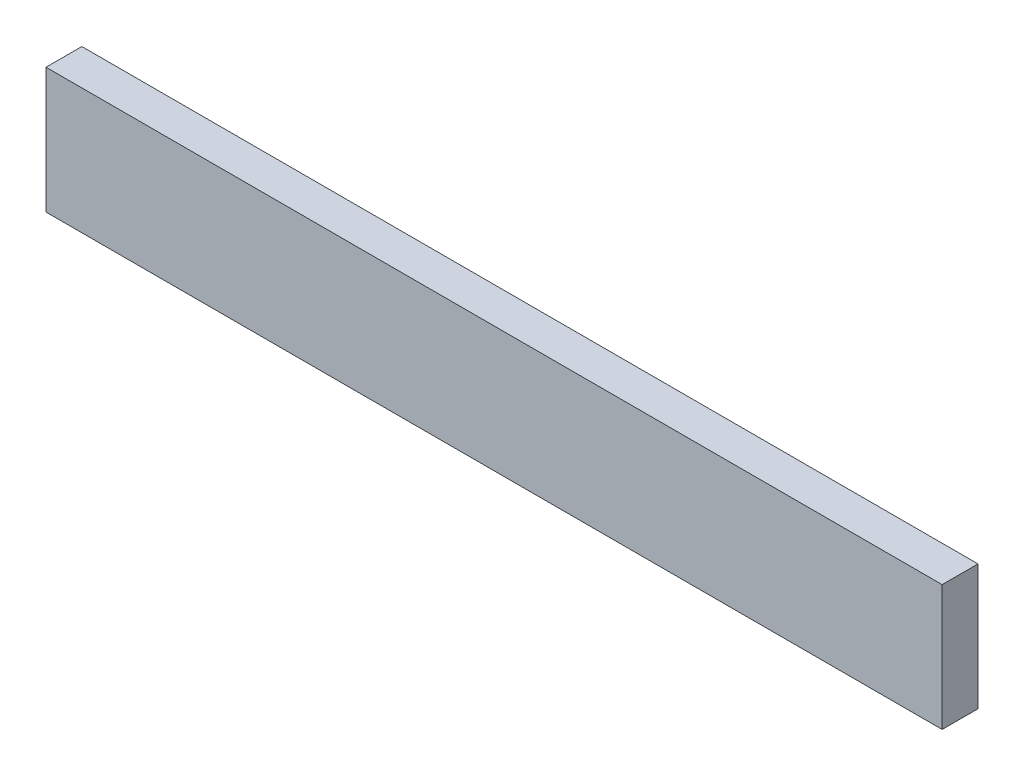
ISO-10303-21;
HEADER;
FILE_DESCRIPTION(('STEP AP214'),'2;1');
FILE_NAME('part.step','',(''),(''),'','','');
FILE_SCHEMA(('AUTOMOTIVE_DESIGN { 1 0 10303 214 1 1 1 1 }'));
ENDSEC;
DATA;
#1=APPLICATION_CONTEXT('core data for automotive mechanical design processes');
#2=APPLICATION_PROTOCOL_DEFINITION('international standard','automotive_design',2000,#1);
#3=PRODUCT_CONTEXT('',#1,'mechanical');
#4=PRODUCT('Part','Part','',(#3));
#5=PRODUCT_RELATED_PRODUCT_CATEGORY('part','',(#4));
#6=PRODUCT_DEFINITION_FORMATION('','',#4);
#7=PRODUCT_DEFINITION_CONTEXT('part definition',#1,'design');
#8=PRODUCT_DEFINITION('design','',#6,#7);
#9=PRODUCT_DEFINITION_SHAPE('','',#8);
#10=(LENGTH_UNIT() NAMED_UNIT(*) SI_UNIT(.MILLI.,.METRE.));
#11=(NAMED_UNIT(*) PLANE_ANGLE_UNIT() SI_UNIT($,.RADIAN.));
#12=(NAMED_UNIT(*) SI_UNIT($,.STERADIAN.) SOLID_ANGLE_UNIT());
#13=UNCERTAINTY_MEASURE_WITH_UNIT(LENGTH_MEASURE(1.E-05),#10,'distance_accuracy_value','');
#14=(GEOMETRIC_REPRESENTATION_CONTEXT(3) GLOBAL_UNCERTAINTY_ASSIGNED_CONTEXT((#13)) GLOBAL_UNIT_ASSIGNED_CONTEXT((#10,
#11,#12)) REPRESENTATION_CONTEXT('',''));
#15=CARTESIAN_POINT('',(0.,0.,0.));
#16=DIRECTION('',(0.,0.,1.));
#17=DIRECTION('',(1.,0.,0.));
#18=AXIS2_PLACEMENT_3D('',#15,#16,#17);
#19=CARTESIAN_POINT('',(250.,-35.,20.));
#20=DIRECTION('',(-1.,0.,0.));
#21=DIRECTION('',(0.,0.,1.));
#22=AXIS2_PLACEMENT_3D('',#19,#20,#21);
#23=PLANE('',#22);
#24=DIRECTION('',(0.,1.,0.));
#25=VECTOR('',#24,1.);
#26=CARTESIAN_POINT('',(250.,-35.,0.));
#27=LINE('',#26,#25);
#28=CARTESIAN_POINT('',(250.,-35.,0.));
#29=VERTEX_POINT('',#28);
#30=CARTESIAN_POINT('',(250.,35.,0.));
#31=VERTEX_POINT('',#30);
#32=EDGE_CURVE('E113',#29,#31,#27,.T.);
#33=ORIENTED_EDGE('',*,*,#32,.T.);
#34=DIRECTION('',(0.,0.,-1.));
#35=VECTOR('',#34,1.);
#36=CARTESIAN_POINT('',(250.,35.,20.));
#37=LINE('',#36,#35);
#38=CARTESIAN_POINT('',(250.,35.,20.));
#39=VERTEX_POINT('',#38);
#40=EDGE_CURVE('E11',#39,#31,#37,.T.);
#41=ORIENTED_EDGE('',*,*,#40,.F.);
#42=DIRECTION('',(0.,1.,0.));
#43=VECTOR('',#42,1.);
#44=CARTESIAN_POINT('',(250.,-35.,20.));
#45=LINE('',#44,#43);
#46=CARTESIAN_POINT('',(250.,-35.,20.));
#47=VERTEX_POINT('',#46);
#48=EDGE_CURVE('E97',#47,#39,#45,.T.);
#49=ORIENTED_EDGE('',*,*,#48,.F.);
#50=DIRECTION('',(0.,0.,-1.));
#51=VECTOR('',#50,1.);
#52=CARTESIAN_POINT('',(250.,-35.,20.));
#53=LINE('',#52,#51);
#54=EDGE_CURVE('E109',#47,#29,#53,.T.);
#55=ORIENTED_EDGE('',*,*,#54,.T.);
#56=EDGE_LOOP('',(#33,#41,#49,#55));
#57=FACE_BOUND('',#56,.T.);
#58=ADVANCED_FACE('F45',(#57),#23,.F.);
#59=CARTESIAN_POINT('',(-250.,35.,20.));
#60=DIRECTION('',(0.,-1.,0.));
#61=DIRECTION('',(0.,0.,-1.));
#62=AXIS2_PLACEMENT_3D('',#59,#60,#61);
#63=PLANE('',#62);
#64=DIRECTION('',(-1.,0.,0.));
#65=VECTOR('',#64,1.);
#66=CARTESIAN_POINT('',(-250.,35.,0.));
#67=LINE('',#66,#65);
#68=CARTESIAN_POINT('',(-250.,35.,0.));
#69=VERTEX_POINT('',#68);
#70=EDGE_CURVE('E102',#31,#69,#67,.T.);
#71=ORIENTED_EDGE('',*,*,#70,.T.);
#72=DIRECTION('',(0.,0.,-1.));
#73=VECTOR('',#72,1.);
#74=CARTESIAN_POINT('',(-250.,35.,20.));
#75=LINE('',#74,#73);
#76=CARTESIAN_POINT('',(-250.,35.,20.));
#77=VERTEX_POINT('',#76);
#78=EDGE_CURVE('E54',#77,#69,#75,.T.);
#79=ORIENTED_EDGE('',*,*,#78,.F.);
#80=DIRECTION('',(-1.,0.,0.));
#81=VECTOR('',#80,1.);
#82=CARTESIAN_POINT('',(-250.,35.,20.));
#83=LINE('',#82,#81);
#84=EDGE_CURVE('E92',#39,#77,#83,.T.);
#85=ORIENTED_EDGE('',*,*,#84,.F.);
#86=ORIENTED_EDGE('',*,*,#40,.T.);
#87=EDGE_LOOP('',(#71,#79,#85,#86));
#88=FACE_BOUND('',#87,.T.);
#89=ADVANCED_FACE('F101',(#88),#63,.F.);
#90=CARTESIAN_POINT('',(-250.,-35.,20.));
#91=DIRECTION('',(1.,0.,0.));
#92=DIRECTION('',(0.,0.,-1.));
#93=AXIS2_PLACEMENT_3D('',#90,#91,#92);
#94=PLANE('',#93);
#95=DIRECTION('',(0.,-1.,0.));
#96=VECTOR('',#95,1.);
#97=CARTESIAN_POINT('',(-250.,-35.,0.));
#98=LINE('',#97,#96);
#99=CARTESIAN_POINT('',(-250.,-35.,0.));
#100=VERTEX_POINT('',#99);
#101=EDGE_CURVE('E79',#69,#100,#98,.T.);
#102=ORIENTED_EDGE('',*,*,#101,.T.);
#103=DIRECTION('',(0.,0.,-1.));
#104=VECTOR('',#103,1.);
#105=CARTESIAN_POINT('',(-250.,-35.,20.));
#106=LINE('',#105,#104);
#107=CARTESIAN_POINT('',(-250.,-35.,20.));
#108=VERTEX_POINT('',#107);
#109=EDGE_CURVE('E104',#108,#100,#106,.T.);
#110=ORIENTED_EDGE('',*,*,#109,.F.);
#111=DIRECTION('',(0.,-1.,0.));
#112=VECTOR('',#111,1.);
#113=CARTESIAN_POINT('',(-250.,-35.,20.));
#114=LINE('',#113,#112);
#115=EDGE_CURVE('E95',#77,#108,#114,.T.);
#116=ORIENTED_EDGE('',*,*,#115,.F.);
#117=ORIENTED_EDGE('',*,*,#78,.T.);
#118=EDGE_LOOP('',(#102,#110,#116,#117));
#119=FACE_BOUND('',#118,.T.);
#120=ADVANCED_FACE('F105',(#119),#94,.F.);
#121=CARTESIAN_POINT('',(-250.,-35.,20.));
#122=DIRECTION('',(0.,1.,0.));
#123=DIRECTION('',(0.,0.,1.));
#124=AXIS2_PLACEMENT_3D('',#121,#122,#123);
#125=PLANE('',#124);
#126=DIRECTION('',(1.,0.,0.));
#127=VECTOR('',#126,1.);
#128=CARTESIAN_POINT('',(-250.,-35.,0.));
#129=LINE('',#128,#127);
#130=EDGE_CURVE('E85',#100,#29,#129,.T.);
#131=ORIENTED_EDGE('',*,*,#130,.T.);
#132=ORIENTED_EDGE('',*,*,#54,.F.);
#133=DIRECTION('',(1.,0.,0.));
#134=VECTOR('',#133,1.);
#135=CARTESIAN_POINT('',(-250.,-35.,20.));
#136=LINE('',#135,#134);
#137=EDGE_CURVE('E62',#108,#47,#136,.T.);
#138=ORIENTED_EDGE('',*,*,#137,.F.);
#139=ORIENTED_EDGE('',*,*,#109,.T.);
#140=EDGE_LOOP('',(#131,#132,#138,#139));
#141=FACE_BOUND('',#140,.T.);
#142=ADVANCED_FACE('F126',(#141),#125,.F.);
#143=CARTESIAN_POINT('',(0.,0.,20.));
#144=DIRECTION('',(0.,0.,-1.));
#145=DIRECTION('',(-1.,0.,0.));
#146=AXIS2_PLACEMENT_3D('',#143,#144,#145);
#147=PLANE('',#146);
#148=ORIENTED_EDGE('',*,*,#48,.T.);
#149=ORIENTED_EDGE('',*,*,#84,.T.);
#150=ORIENTED_EDGE('',*,*,#115,.T.);
#151=ORIENTED_EDGE('',*,*,#137,.T.);
#152=EDGE_LOOP('',(#148,#149,#150,#151));
#153=FACE_BOUND('',#152,.T.);
#154=ADVANCED_FACE('F93',(#153),#147,.F.);
#155=CARTESIAN_POINT('',(0.,0.,0.));
#156=DIRECTION('',(0.,0.,-1.));
#157=DIRECTION('',(-1.,0.,0.));
#158=AXIS2_PLACEMENT_3D('',#155,#156,#157);
#159=PLANE('',#158);
#160=ORIENTED_EDGE('',*,*,#32,.F.);
#161=ORIENTED_EDGE('',*,*,#130,.F.);
#162=ORIENTED_EDGE('',*,*,#101,.F.);
#163=ORIENTED_EDGE('',*,*,#70,.F.);
#164=EDGE_LOOP('',(#160,#161,#162,#163));
#165=FACE_BOUND('',#164,.T.);
#166=ADVANCED_FACE('F129',(#165),#159,.T.);
#167=CLOSED_SHELL('',(#58,#89,#120,#142,#154,#166));
#168=MANIFOLD_SOLID_BREP('B2',#167);
#169=ADVANCED_BREP_SHAPE_REPRESENTATION('',(#18,#168),#14);
#170=SHAPE_DEFINITION_REPRESENTATION(#9,#169);
ENDSEC;
END-ISO-10303-21;
